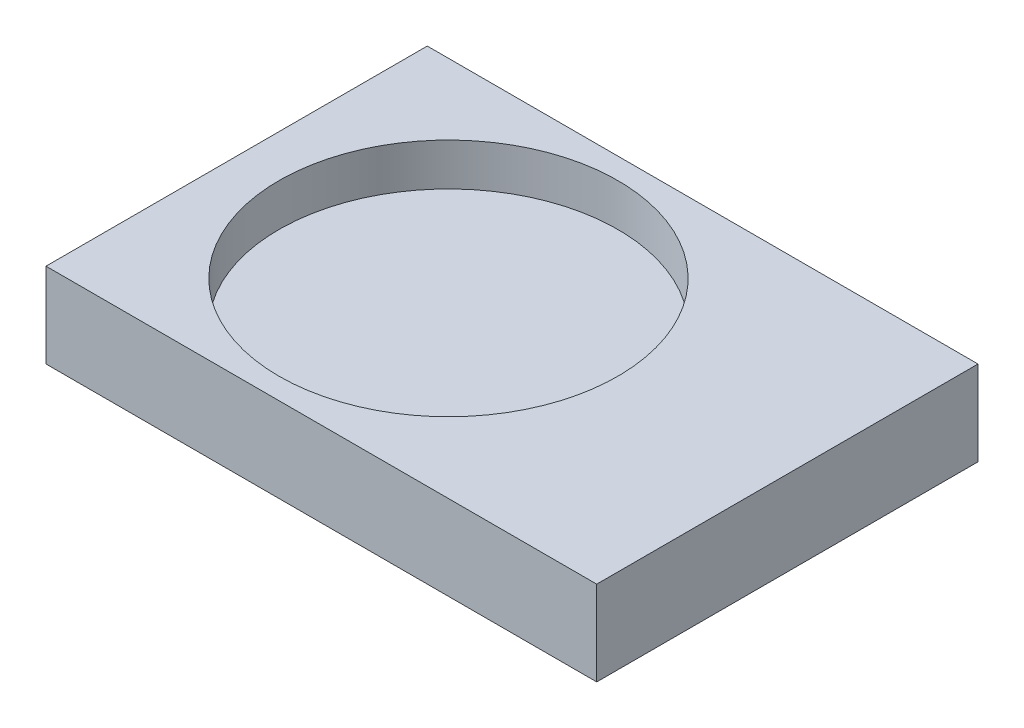
ISO-10303-21;
HEADER;
FILE_DESCRIPTION(('STEP AP214'),'2;1');
FILE_NAME('part.step','',(''),(''),'','','');
FILE_SCHEMA(('AUTOMOTIVE_DESIGN { 1 0 10303 214 1 1 1 1 }'));
ENDSEC;
DATA;
#1=APPLICATION_CONTEXT('core data for automotive mechanical design processes');
#2=APPLICATION_PROTOCOL_DEFINITION('international standard','automotive_design',2000,#1);
#3=PRODUCT_CONTEXT('',#1,'mechanical');
#4=PRODUCT('Part','Part','',(#3));
#5=PRODUCT_RELATED_PRODUCT_CATEGORY('part','',(#4));
#6=PRODUCT_DEFINITION_FORMATION('','',#4);
#7=PRODUCT_DEFINITION_CONTEXT('part definition',#1,'design');
#8=PRODUCT_DEFINITION('design','',#6,#7);
#9=PRODUCT_DEFINITION_SHAPE('','',#8);
#10=(LENGTH_UNIT() NAMED_UNIT(*) SI_UNIT(.MILLI.,.METRE.));
#11=(NAMED_UNIT(*) PLANE_ANGLE_UNIT() SI_UNIT($,.RADIAN.));
#12=(NAMED_UNIT(*) SI_UNIT($,.STERADIAN.) SOLID_ANGLE_UNIT());
#13=UNCERTAINTY_MEASURE_WITH_UNIT(LENGTH_MEASURE(1.E-05),#10,'distance_accuracy_value','');
#14=(GEOMETRIC_REPRESENTATION_CONTEXT(3) GLOBAL_UNCERTAINTY_ASSIGNED_CONTEXT((#13)) GLOBAL_UNIT_ASSIGNED_CONTEXT((#10,
#11,#12)) REPRESENTATION_CONTEXT('',''));
#15=CARTESIAN_POINT('',(0.,0.,0.));
#16=DIRECTION('',(0.,0.,1.));
#17=DIRECTION('',(1.,0.,0.));
#18=AXIS2_PLACEMENT_3D('',#15,#16,#17);
#19=CARTESIAN_POINT('',(0.,100.,0.));
#20=DIRECTION('',(1.,0.,0.));
#21=DIRECTION('',(0.,0.,-1.));
#22=AXIS2_PLACEMENT_3D('',#19,#20,#21);
#23=PLANE('',#22);
#24=DIRECTION('',(0.,0.,1.));
#25=VECTOR('',#24,1.);
#26=CARTESIAN_POINT('',(0.,0.,0.));
#27=LINE('',#26,#25);
#28=CARTESIAN_POINT('',(0.,0.,-450.));
#29=VERTEX_POINT('',#28);
#30=CARTESIAN_POINT('',(0.,0.,0.));
#31=VERTEX_POINT('',#30);
#32=EDGE_CURVE('E99',#29,#31,#27,.T.);
#33=ORIENTED_EDGE('',*,*,#32,.T.);
#34=DIRECTION('',(0.,-1.,0.));
#35=VECTOR('',#34,1.);
#36=CARTESIAN_POINT('',(0.,100.,0.));
#37=LINE('',#36,#35);
#38=CARTESIAN_POINT('',(0.,100.,0.));
#39=VERTEX_POINT('',#38);
#40=EDGE_CURVE('E11',#39,#31,#37,.T.);
#41=ORIENTED_EDGE('',*,*,#40,.F.);
#42=DIRECTION('',(0.,0.,1.));
#43=VECTOR('',#42,1.);
#44=CARTESIAN_POINT('',(0.,100.,0.));
#45=LINE('',#44,#43);
#46=CARTESIAN_POINT('',(0.,100.,-450.));
#47=VERTEX_POINT('',#46);
#48=EDGE_CURVE('E87',#47,#39,#45,.T.);
#49=ORIENTED_EDGE('',*,*,#48,.F.);
#50=DIRECTION('',(0.,-1.,0.));
#51=VECTOR('',#50,1.);
#52=CARTESIAN_POINT('',(0.,100.,-450.));
#53=LINE('',#52,#51);
#54=EDGE_CURVE('E95',#47,#29,#53,.T.);
#55=ORIENTED_EDGE('',*,*,#54,.T.);
#56=EDGE_LOOP('',(#33,#41,#49,#55));
#57=FACE_BOUND('',#56,.T.);
#58=ADVANCED_FACE('F36',(#57),#23,.F.);
#59=CARTESIAN_POINT('',(0.,100.,0.));
#60=DIRECTION('',(0.,0.,-1.));
#61=DIRECTION('',(-1.,0.,0.));
#62=AXIS2_PLACEMENT_3D('',#59,#60,#61);
#63=PLANE('',#62);
#64=DIRECTION('',(1.,0.,0.));
#65=VECTOR('',#64,1.);
#66=CARTESIAN_POINT('',(0.,0.,0.));
#67=LINE('',#66,#65);
#68=CARTESIAN_POINT('',(650.,0.,0.));
#69=VERTEX_POINT('',#68);
#70=EDGE_CURVE('E91',#31,#69,#67,.T.);
#71=ORIENTED_EDGE('',*,*,#70,.T.);
#72=DIRECTION('',(0.,-1.,0.));
#73=VECTOR('',#72,1.);
#74=CARTESIAN_POINT('',(650.,100.,0.));
#75=LINE('',#74,#73);
#76=CARTESIAN_POINT('',(650.,100.,0.));
#77=VERTEX_POINT('',#76);
#78=EDGE_CURVE('E44',#77,#69,#75,.T.);
#79=ORIENTED_EDGE('',*,*,#78,.F.);
#80=DIRECTION('',(1.,0.,0.));
#81=VECTOR('',#80,1.);
#82=CARTESIAN_POINT('',(0.,100.,0.));
#83=LINE('',#82,#81);
#84=EDGE_CURVE('E82',#39,#77,#83,.T.);
#85=ORIENTED_EDGE('',*,*,#84,.F.);
#86=ORIENTED_EDGE('',*,*,#40,.T.);
#87=EDGE_LOOP('',(#71,#79,#85,#86));
#88=FACE_BOUND('',#87,.T.);
#89=ADVANCED_FACE('F90',(#88),#63,.F.);
#90=CARTESIAN_POINT('',(650.,100.,0.));
#91=DIRECTION('',(-1.,0.,0.));
#92=DIRECTION('',(0.,0.,1.));
#93=AXIS2_PLACEMENT_3D('',#90,#91,#92);
#94=PLANE('',#93);
#95=DIRECTION('',(0.,0.,-1.));
#96=VECTOR('',#95,1.);
#97=CARTESIAN_POINT('',(650.,0.,0.));
#98=LINE('',#97,#96);
#99=CARTESIAN_POINT('',(650.,0.,-450.));
#100=VERTEX_POINT('',#99);
#101=EDGE_CURVE('E69',#69,#100,#98,.T.);
#102=ORIENTED_EDGE('',*,*,#101,.T.);
#103=DIRECTION('',(0.,-1.,0.));
#104=VECTOR('',#103,1.);
#105=CARTESIAN_POINT('',(650.,100.,-450.));
#106=LINE('',#105,#104);
#107=CARTESIAN_POINT('',(650.,100.,-450.));
#108=VERTEX_POINT('',#107);
#109=EDGE_CURVE('E92',#108,#100,#106,.T.);
#110=ORIENTED_EDGE('',*,*,#109,.F.);
#111=DIRECTION('',(0.,0.,-1.));
#112=VECTOR('',#111,1.);
#113=CARTESIAN_POINT('',(650.,100.,0.));
#114=LINE('',#113,#112);
#115=EDGE_CURVE('E85',#77,#108,#114,.T.);
#116=ORIENTED_EDGE('',*,*,#115,.F.);
#117=ORIENTED_EDGE('',*,*,#78,.T.);
#118=EDGE_LOOP('',(#102,#110,#116,#117));
#119=FACE_BOUND('',#118,.T.);
#120=ADVANCED_FACE('F93',(#119),#94,.F.);
#121=CARTESIAN_POINT('',(0.,100.,-450.));
#122=DIRECTION('',(0.,0.,1.));
#123=DIRECTION('',(1.,0.,0.));
#124=AXIS2_PLACEMENT_3D('',#121,#122,#123);
#125=PLANE('',#124);
#126=DIRECTION('',(-1.,0.,0.));
#127=VECTOR('',#126,1.);
#128=CARTESIAN_POINT('',(0.,0.,-450.));
#129=LINE('',#128,#127);
#130=EDGE_CURVE('E75',#100,#29,#129,.T.);
#131=ORIENTED_EDGE('',*,*,#130,.T.);
#132=ORIENTED_EDGE('',*,*,#54,.F.);
#133=DIRECTION('',(-1.,0.,0.));
#134=VECTOR('',#133,1.);
#135=CARTESIAN_POINT('',(0.,100.,-450.));
#136=LINE('',#135,#134);
#137=EDGE_CURVE('E52',#108,#47,#136,.T.);
#138=ORIENTED_EDGE('',*,*,#137,.F.);
#139=ORIENTED_EDGE('',*,*,#109,.T.);
#140=EDGE_LOOP('',(#131,#132,#138,#139));
#141=FACE_BOUND('',#140,.T.);
#142=ADVANCED_FACE('F107',(#141),#125,.F.);
#143=CARTESIAN_POINT('',(0.,100.,0.));
#144=DIRECTION('',(0.,-1.,0.));
#145=DIRECTION('',(0.,0.,-1.));
#146=AXIS2_PLACEMENT_3D('',#143,#144,#145);
#147=PLANE('',#146);
#148=CARTESIAN_POINT('',(250.,100.,-225.));
#149=DIRECTION('',(0.,1.,0.));
#150=DIRECTION('',(0.,0.,1.));
#151=AXIS2_PLACEMENT_3D('',#148,#149,#150);
#152=CIRCLE('',#151,200.);
#153=CARTESIAN_POINT('',(250.,100.,-25.0000000000002));
#154=VERTEX_POINT('',#153);
#155=EDGE_CURVE('E113',#154,#154,#152,.T.);
#156=ORIENTED_EDGE('',*,*,#155,.F.);
#157=EDGE_LOOP('',(#156));
#158=FACE_BOUND('',#157,.T.);
#159=ORIENTED_EDGE('',*,*,#48,.T.);
#160=ORIENTED_EDGE('',*,*,#84,.T.);
#161=ORIENTED_EDGE('',*,*,#115,.T.);
#162=ORIENTED_EDGE('',*,*,#137,.T.);
#163=EDGE_LOOP('',(#159,#160,#161,#162));
#164=FACE_BOUND('',#163,.T.);
#165=ADVANCED_FACE('F83',(#158,#164),#147,.F.);
#166=CARTESIAN_POINT('',(0.,0.,0.));
#167=DIRECTION('',(0.,-1.,0.));
#168=DIRECTION('',(0.,0.,-1.));
#169=AXIS2_PLACEMENT_3D('',#166,#167,#168);
#170=PLANE('',#169);
#171=ORIENTED_EDGE('',*,*,#32,.F.);
#172=ORIENTED_EDGE('',*,*,#130,.F.);
#173=ORIENTED_EDGE('',*,*,#101,.F.);
#174=ORIENTED_EDGE('',*,*,#70,.F.);
#175=EDGE_LOOP('',(#171,#172,#173,#174));
#176=FACE_BOUND('',#175,.T.);
#177=ADVANCED_FACE('F110',(#176),#170,.T.);
#178=CARTESIAN_POINT('',(250.,50.,-225.));
#179=DIRECTION('',(0.,1.,0.));
#180=DIRECTION('',(0.,0.,1.));
#181=AXIS2_PLACEMENT_3D('',#178,#179,#180);
#182=CYLINDRICAL_SURFACE('',#181,200.);
#183=CARTESIAN_POINT('',(250.,50.,-225.));
#184=DIRECTION('',(0.,1.,0.));
#185=DIRECTION('',(0.,0.,1.));
#186=AXIS2_PLACEMENT_3D('',#183,#184,#185);
#187=CIRCLE('',#186,200.);
#188=CARTESIAN_POINT('',(250.,50.,-25.0000000000002));
#189=VERTEX_POINT('',#188);
#190=EDGE_CURVE('E102',#189,#189,#187,.T.);
#191=ORIENTED_EDGE('',*,*,#190,.F.);
#192=EDGE_LOOP('',(#191));
#193=FACE_BOUND('',#192,.T.);
#194=ORIENTED_EDGE('',*,*,#155,.T.);
#195=EDGE_LOOP('',(#194));
#196=FACE_BOUND('',#195,.T.);
#197=ADVANCED_FACE('F121',(#193,#196),#182,.F.);
#198=CARTESIAN_POINT('',(250.,50.,-225.));
#199=DIRECTION('',(0.,1.,0.));
#200=DIRECTION('',(0.,0.,1.));
#201=AXIS2_PLACEMENT_3D('',#198,#199,#200);
#202=PLANE('',#201);
#203=ORIENTED_EDGE('',*,*,#190,.T.);
#204=EDGE_LOOP('',(#203));
#205=FACE_BOUND('',#204,.T.);
#206=ADVANCED_FACE('F119',(#205),#202,.T.);
#207=CLOSED_SHELL('',(#58,#89,#120,#142,#165,#177,#197,#206));
#208=MANIFOLD_SOLID_BREP('B2',#207);
#209=ADVANCED_BREP_SHAPE_REPRESENTATION('',(#18,#208),#14);
#210=SHAPE_DEFINITION_REPRESENTATION(#9,#209);
ENDSEC;
END-ISO-10303-21;
